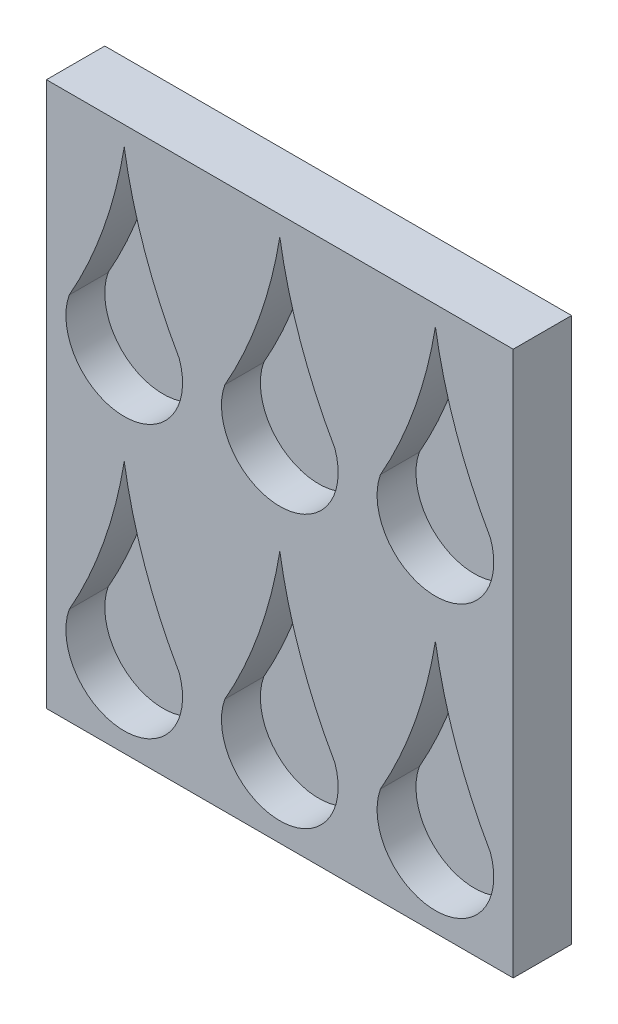
ISO-10303-21;
HEADER;
FILE_DESCRIPTION(('STEP AP214'),'2;1');
FILE_NAME('part.step','',(''),(''),'','','');
FILE_SCHEMA(('AUTOMOTIVE_DESIGN { 1 0 10303 214 1 1 1 1 }'));
ENDSEC;
DATA;
#1=APPLICATION_CONTEXT('core data for automotive mechanical design processes');
#2=APPLICATION_PROTOCOL_DEFINITION('international standard','automotive_design',2000,#1);
#3=PRODUCT_CONTEXT('',#1,'mechanical');
#4=PRODUCT('Part','Part','',(#3));
#5=PRODUCT_RELATED_PRODUCT_CATEGORY('part','',(#4));
#6=PRODUCT_DEFINITION_FORMATION('','',#4);
#7=PRODUCT_DEFINITION_CONTEXT('part definition',#1,'design');
#8=PRODUCT_DEFINITION('design','',#6,#7);
#9=PRODUCT_DEFINITION_SHAPE('','',#8);
#10=(LENGTH_UNIT() NAMED_UNIT(*) SI_UNIT(.MILLI.,.METRE.));
#11=(NAMED_UNIT(*) PLANE_ANGLE_UNIT() SI_UNIT($,.RADIAN.));
#12=(NAMED_UNIT(*) SI_UNIT($,.STERADIAN.) SOLID_ANGLE_UNIT());
#13=UNCERTAINTY_MEASURE_WITH_UNIT(LENGTH_MEASURE(1.E-05),#10,'distance_accuracy_value','');
#14=(GEOMETRIC_REPRESENTATION_CONTEXT(3) GLOBAL_UNCERTAINTY_ASSIGNED_CONTEXT((#13)) GLOBAL_UNIT_ASSIGNED_CONTEXT((#10,
#11,#12)) REPRESENTATION_CONTEXT('',''));
#15=CARTESIAN_POINT('',(0.,0.,0.));
#16=DIRECTION('',(0.,0.,1.));
#17=DIRECTION('',(1.,0.,0.));
#18=AXIS2_PLACEMENT_3D('',#15,#16,#17);
#19=CARTESIAN_POINT('',(101.6,151.599949999975,6.35));
#20=DIRECTION('',(0.,0.,1.));
#21=DIRECTION('',(1.,0.,0.));
#22=AXIS2_PLACEMENT_3D('',#19,#20,#21);
#23=PLANE('',#22);
#24=CARTESIAN_POINT('',(-48.8014709369517,151.599949999975,6.35));
#25=DIRECTION('',(0.,0.,-1.));
#26=DIRECTION('',(1.,0.,0.));
#27=AXIS2_PLACEMENT_3D('',#24,#25,#26);
#28=CIRCLE('',#27,152.4);
#29=CARTESIAN_POINT('',(101.6,127.,6.35));
#30=VERTEX_POINT('',#29);
#31=CARTESIAN_POINT('',(83.6394877578617,76.2,6.35));
#32=VERTEX_POINT('',#31);
#33=EDGE_CURVE('E59',#30,#32,#28,.T.);
#34=ORIENTED_EDGE('',*,*,#33,.T.);
#35=CARTESIAN_POINT('',(101.6,69.85,6.35));
#36=DIRECTION('',(0.,0.,1.));
#37=DIRECTION('',(1.,0.,0.));
#38=AXIS2_PLACEMENT_3D('',#35,#36,#37);
#39=CIRCLE('',#38,19.05);
#40=CARTESIAN_POINT('',(119.560512242138,76.2,6.35));
#41=VERTEX_POINT('',#40);
#42=EDGE_CURVE('E11',#32,#41,#39,.T.);
#43=ORIENTED_EDGE('',*,*,#42,.T.);
#44=CARTESIAN_POINT('',(252.001470936952,151.599949999975,6.35));
#45=DIRECTION('',(0.,0.,-1.));
#46=DIRECTION('',(-1.,0.,0.));
#47=AXIS2_PLACEMENT_3D('',#44,#45,#46);
#48=CIRCLE('',#47,152.4);
#49=EDGE_CURVE('E51',#41,#30,#48,.T.);
#50=ORIENTED_EDGE('',*,*,#49,.T.);
#51=EDGE_LOOP('',(#34,#43,#50));
#52=FACE_BOUND('',#51,.T.);
#53=ADVANCED_FACE('F37',(#52),#23,.T.);
#54=CARTESIAN_POINT('',(101.6,69.85,6.35));
#55=DIRECTION('',(0.,0.,1.));
#56=DIRECTION('',(1.,0.,0.));
#57=AXIS2_PLACEMENT_3D('',#54,#55,#56);
#58=CYLINDRICAL_SURFACE('',#57,19.05);
#59=CARTESIAN_POINT('',(101.6,69.85,19.05));
#60=DIRECTION('',(0.,0.,1.));
#61=DIRECTION('',(1.,0.,0.));
#62=AXIS2_PLACEMENT_3D('',#59,#60,#61);
#63=CIRCLE('',#62,19.05);
#64=CARTESIAN_POINT('',(83.6394877578617,76.2,19.05));
#65=VERTEX_POINT('',#64);
#66=CARTESIAN_POINT('',(119.560512242138,76.2,19.05));
#67=VERTEX_POINT('',#66);
#68=EDGE_CURVE('E358',#65,#67,#63,.T.);
#69=ORIENTED_EDGE('',*,*,#68,.T.);
#70=DIRECTION('',(0.,0.,1.));
#71=VECTOR('',#70,1.);
#72=CARTESIAN_POINT('',(119.560512242138,76.2,6.35));
#73=LINE('',#72,#71);
#74=EDGE_CURVE('E44',#41,#67,#73,.T.);
#75=ORIENTED_EDGE('',*,*,#74,.F.);
#76=ORIENTED_EDGE('',*,*,#42,.F.);
#77=DIRECTION('',(0.,0.,1.));
#78=VECTOR('',#77,1.);
#79=CARTESIAN_POINT('',(83.6394877578617,76.2,6.35));
#80=LINE('',#79,#78);
#81=EDGE_CURVE('E361',#32,#65,#80,.T.);
#82=ORIENTED_EDGE('',*,*,#81,.T.);
#83=EDGE_LOOP('',(#69,#75,#76,#82));
#84=FACE_BOUND('',#83,.T.);
#85=ADVANCED_FACE('F370',(#84),#58,.F.);
#86=CARTESIAN_POINT('',(252.001470936952,151.599949999975,6.35));
#87=DIRECTION('',(0.,0.,1.));
#88=DIRECTION('',(1.,0.,0.));
#89=AXIS2_PLACEMENT_3D('',#86,#87,#88);
#90=CYLINDRICAL_SURFACE('',#89,152.4);
#91=CARTESIAN_POINT('',(252.001470936952,151.599949999975,19.05));
#92=DIRECTION('',(0.,0.,-1.));
#93=DIRECTION('',(-1.,0.,0.));
#94=AXIS2_PLACEMENT_3D('',#91,#92,#93);
#95=CIRCLE('',#94,152.4);
#96=CARTESIAN_POINT('',(101.6,127.,19.05));
#97=VERTEX_POINT('',#96);
#98=EDGE_CURVE('E355',#67,#97,#95,.T.);
#99=ORIENTED_EDGE('',*,*,#98,.T.);
#100=DIRECTION('',(0.,0.,1.));
#101=VECTOR('',#100,1.);
#102=CARTESIAN_POINT('',(101.6,127.,6.35));
#103=LINE('',#102,#101);
#104=EDGE_CURVE('E365',#30,#97,#103,.T.);
#105=ORIENTED_EDGE('',*,*,#104,.F.);
#106=ORIENTED_EDGE('',*,*,#49,.F.);
#107=ORIENTED_EDGE('',*,*,#74,.T.);
#108=EDGE_LOOP('',(#99,#105,#106,#107));
#109=FACE_BOUND('',#108,.T.);
#110=ADVANCED_FACE('F367',(#109),#90,.T.);
#111=CARTESIAN_POINT('',(-48.8014709369517,151.599949999975,6.35));
#112=DIRECTION('',(0.,0.,1.));
#113=DIRECTION('',(1.,0.,0.));
#114=AXIS2_PLACEMENT_3D('',#111,#112,#113);
#115=CYLINDRICAL_SURFACE('',#114,152.4);
#116=CARTESIAN_POINT('',(-48.8014709369517,151.599949999975,19.05));
#117=DIRECTION('',(0.,0.,-1.));
#118=DIRECTION('',(1.,0.,0.));
#119=AXIS2_PLACEMENT_3D('',#116,#117,#118);
#120=CIRCLE('',#119,152.4);
#121=EDGE_CURVE('E353',#97,#65,#120,.T.);
#122=ORIENTED_EDGE('',*,*,#121,.T.);
#123=ORIENTED_EDGE('',*,*,#81,.F.);
#124=ORIENTED_EDGE('',*,*,#33,.F.);
#125=ORIENTED_EDGE('',*,*,#104,.T.);
#126=EDGE_LOOP('',(#122,#123,#124,#125));
#127=FACE_BOUND('',#126,.T.);
#128=ADVANCED_FACE('F380',(#127),#115,.T.);
#129=CARTESIAN_POINT('',(50.8,151.599949999975,6.35));
#130=DIRECTION('',(0.,0.,1.));
#131=DIRECTION('',(1.,0.,0.));
#132=AXIS2_PLACEMENT_3D('',#129,#130,#131);
#133=PLANE('',#132);
#134=CARTESIAN_POINT('',(-99.6014709369517,151.599949999975,6.35));
#135=DIRECTION('',(0.,0.,-1.));
#136=DIRECTION('',(1.,0.,0.));
#137=AXIS2_PLACEMENT_3D('',#134,#135,#136);
#138=CIRCLE('',#137,152.4);
#139=CARTESIAN_POINT('',(50.8,127.,6.35));
#140=VERTEX_POINT('',#139);
#141=CARTESIAN_POINT('',(32.8394877578617,76.2,6.35));
#142=VERTEX_POINT('',#141);
#143=EDGE_CURVE('E338',#140,#142,#138,.T.);
#144=ORIENTED_EDGE('',*,*,#143,.T.);
#145=CARTESIAN_POINT('',(50.8,69.85,6.35));
#146=DIRECTION('',(0.,0.,1.));
#147=DIRECTION('',(1.,0.,0.));
#148=AXIS2_PLACEMENT_3D('',#145,#146,#147);
#149=CIRCLE('',#148,19.05);
#150=CARTESIAN_POINT('',(68.7605122421383,76.2,6.35));
#151=VERTEX_POINT('',#150);
#152=EDGE_CURVE('E350',#142,#151,#149,.T.);
#153=ORIENTED_EDGE('',*,*,#152,.T.);
#154=CARTESIAN_POINT('',(201.201470936952,151.599949999975,6.35));
#155=DIRECTION('',(0.,0.,-1.));
#156=DIRECTION('',(-1.,0.,0.));
#157=AXIS2_PLACEMENT_3D('',#154,#155,#156);
#158=CIRCLE('',#157,152.4);
#159=EDGE_CURVE('E344',#151,#140,#158,.T.);
#160=ORIENTED_EDGE('',*,*,#159,.T.);
#161=EDGE_LOOP('',(#144,#153,#160));
#162=FACE_BOUND('',#161,.T.);
#163=ADVANCED_FACE('F385',(#162),#133,.T.);
#164=CARTESIAN_POINT('',(50.8,69.85,6.35));
#165=DIRECTION('',(0.,0.,1.));
#166=DIRECTION('',(1.,0.,0.));
#167=AXIS2_PLACEMENT_3D('',#164,#165,#166);
#168=CYLINDRICAL_SURFACE('',#167,19.05);
#169=CARTESIAN_POINT('',(50.8,69.85,19.05));
#170=DIRECTION('',(0.,0.,1.));
#171=DIRECTION('',(1.,0.,0.));
#172=AXIS2_PLACEMENT_3D('',#169,#170,#171);
#173=CIRCLE('',#172,19.05);
#174=CARTESIAN_POINT('',(32.8394877578617,76.2,19.05));
#175=VERTEX_POINT('',#174);
#176=CARTESIAN_POINT('',(68.7605122421383,76.2,19.05));
#177=VERTEX_POINT('',#176);
#178=EDGE_CURVE('E332',#175,#177,#173,.T.);
#179=ORIENTED_EDGE('',*,*,#178,.T.);
#180=DIRECTION('',(0.,0.,1.));
#181=VECTOR('',#180,1.);
#182=CARTESIAN_POINT('',(68.7605122421383,76.2,6.35));
#183=LINE('',#182,#181);
#184=EDGE_CURVE('E347',#151,#177,#183,.T.);
#185=ORIENTED_EDGE('',*,*,#184,.F.);
#186=ORIENTED_EDGE('',*,*,#152,.F.);
#187=DIRECTION('',(0.,0.,1.));
#188=VECTOR('',#187,1.);
#189=CARTESIAN_POINT('',(32.8394877578617,76.2,6.35));
#190=LINE('',#189,#188);
#191=EDGE_CURVE('E335',#142,#175,#190,.T.);
#192=ORIENTED_EDGE('',*,*,#191,.T.);
#193=EDGE_LOOP('',(#179,#185,#186,#192));
#194=FACE_BOUND('',#193,.T.);
#195=ADVANCED_FACE('F388',(#194),#168,.F.);
#196=CARTESIAN_POINT('',(201.201470936952,151.599949999975,6.35));
#197=DIRECTION('',(0.,0.,1.));
#198=DIRECTION('',(1.,0.,0.));
#199=AXIS2_PLACEMENT_3D('',#196,#197,#198);
#200=CYLINDRICAL_SURFACE('',#199,152.4);
#201=CARTESIAN_POINT('',(201.201470936952,151.599949999975,19.05));
#202=DIRECTION('',(0.,0.,-1.));
#203=DIRECTION('',(-1.,0.,0.));
#204=AXIS2_PLACEMENT_3D('',#201,#202,#203);
#205=CIRCLE('',#204,152.4);
#206=CARTESIAN_POINT('',(50.8,127.,19.05));
#207=VERTEX_POINT('',#206);
#208=EDGE_CURVE('E329',#177,#207,#205,.T.);
#209=ORIENTED_EDGE('',*,*,#208,.T.);
#210=DIRECTION('',(0.,0.,1.));
#211=VECTOR('',#210,1.);
#212=CARTESIAN_POINT('',(50.8,127.,6.35));
#213=LINE('',#212,#211);
#214=EDGE_CURVE('E341',#140,#207,#213,.T.);
#215=ORIENTED_EDGE('',*,*,#214,.F.);
#216=ORIENTED_EDGE('',*,*,#159,.F.);
#217=ORIENTED_EDGE('',*,*,#184,.T.);
#218=EDGE_LOOP('',(#209,#215,#216,#217));
#219=FACE_BOUND('',#218,.T.);
#220=ADVANCED_FACE('F392',(#219),#200,.T.);
#221=CARTESIAN_POINT('',(-99.6014709369517,151.599949999975,6.35));
#222=DIRECTION('',(0.,0.,1.));
#223=DIRECTION('',(1.,0.,0.));
#224=AXIS2_PLACEMENT_3D('',#221,#222,#223);
#225=CYLINDRICAL_SURFACE('',#224,152.4);
#226=CARTESIAN_POINT('',(-99.6014709369517,151.599949999975,19.05));
#227=DIRECTION('',(0.,0.,-1.));
#228=DIRECTION('',(1.,0.,0.));
#229=AXIS2_PLACEMENT_3D('',#226,#227,#228);
#230=CIRCLE('',#229,152.4);
#231=EDGE_CURVE('E327',#207,#175,#230,.T.);
#232=ORIENTED_EDGE('',*,*,#231,.T.);
#233=ORIENTED_EDGE('',*,*,#191,.F.);
#234=ORIENTED_EDGE('',*,*,#143,.F.);
#235=ORIENTED_EDGE('',*,*,#214,.T.);
#236=EDGE_LOOP('',(#232,#233,#234,#235));
#237=FACE_BOUND('',#236,.T.);
#238=ADVANCED_FACE('F396',(#237),#225,.T.);
#239=CARTESIAN_POINT('',(0.,151.599949999975,6.35));
#240=DIRECTION('',(0.,0.,1.));
#241=DIRECTION('',(1.,0.,0.));
#242=AXIS2_PLACEMENT_3D('',#239,#240,#241);
#243=PLANE('',#242);
#244=CARTESIAN_POINT('',(-150.401470936952,151.599949999975,6.35));
#245=DIRECTION('',(0.,0.,-1.));
#246=DIRECTION('',(1.,0.,0.));
#247=AXIS2_PLACEMENT_3D('',#244,#245,#246);
#248=CIRCLE('',#247,152.4);
#249=CARTESIAN_POINT('',(0.,127.,6.35));
#250=VERTEX_POINT('',#249);
#251=CARTESIAN_POINT('',(-17.9605122421383,76.2,6.35));
#252=VERTEX_POINT('',#251);
#253=EDGE_CURVE('E312',#250,#252,#248,.T.);
#254=ORIENTED_EDGE('',*,*,#253,.T.);
#255=CARTESIAN_POINT('',(0.,69.85,6.35));
#256=DIRECTION('',(0.,0.,1.));
#257=DIRECTION('',(1.,0.,0.));
#258=AXIS2_PLACEMENT_3D('',#255,#256,#257);
#259=CIRCLE('',#258,19.05);
#260=CARTESIAN_POINT('',(17.9605122421383,76.2,6.35));
#261=VERTEX_POINT('',#260);
#262=EDGE_CURVE('E324',#252,#261,#259,.T.);
#263=ORIENTED_EDGE('',*,*,#262,.T.);
#264=CARTESIAN_POINT('',(150.401470936952,151.599949999975,6.35));
#265=DIRECTION('',(0.,0.,-1.));
#266=DIRECTION('',(-1.,0.,0.));
#267=AXIS2_PLACEMENT_3D('',#264,#265,#266);
#268=CIRCLE('',#267,152.4);
#269=EDGE_CURVE('E318',#261,#250,#268,.T.);
#270=ORIENTED_EDGE('',*,*,#269,.T.);
#271=EDGE_LOOP('',(#254,#263,#270));
#272=FACE_BOUND('',#271,.T.);
#273=ADVANCED_FACE('F400',(#272),#243,.T.);
#274=CARTESIAN_POINT('',(0.,69.85,6.35));
#275=DIRECTION('',(0.,0.,1.));
#276=DIRECTION('',(1.,0.,0.));
#277=AXIS2_PLACEMENT_3D('',#274,#275,#276);
#278=CYLINDRICAL_SURFACE('',#277,19.05);
#279=CARTESIAN_POINT('',(0.,69.85,19.05));
#280=DIRECTION('',(0.,0.,1.));
#281=DIRECTION('',(1.,0.,0.));
#282=AXIS2_PLACEMENT_3D('',#279,#280,#281);
#283=CIRCLE('',#282,19.05);
#284=CARTESIAN_POINT('',(-17.9605122421383,76.2,19.05));
#285=VERTEX_POINT('',#284);
#286=CARTESIAN_POINT('',(17.9605122421383,76.2,19.05));
#287=VERTEX_POINT('',#286);
#288=EDGE_CURVE('E306',#285,#287,#283,.T.);
#289=ORIENTED_EDGE('',*,*,#288,.T.);
#290=DIRECTION('',(0.,0.,1.));
#291=VECTOR('',#290,1.);
#292=CARTESIAN_POINT('',(17.9605122421383,76.2,6.35));
#293=LINE('',#292,#291);
#294=EDGE_CURVE('E321',#261,#287,#293,.T.);
#295=ORIENTED_EDGE('',*,*,#294,.F.);
#296=ORIENTED_EDGE('',*,*,#262,.F.);
#297=DIRECTION('',(0.,0.,1.));
#298=VECTOR('',#297,1.);
#299=CARTESIAN_POINT('',(-17.9605122421383,76.2,6.35));
#300=LINE('',#299,#298);
#301=EDGE_CURVE('E309',#252,#285,#300,.T.);
#302=ORIENTED_EDGE('',*,*,#301,.T.);
#303=EDGE_LOOP('',(#289,#295,#296,#302));
#304=FACE_BOUND('',#303,.T.);
#305=ADVANCED_FACE('F404',(#304),#278,.F.);
#306=CARTESIAN_POINT('',(150.401470936952,151.599949999975,6.35));
#307=DIRECTION('',(0.,0.,1.));
#308=DIRECTION('',(1.,0.,0.));
#309=AXIS2_PLACEMENT_3D('',#306,#307,#308);
#310=CYLINDRICAL_SURFACE('',#309,152.4);
#311=CARTESIAN_POINT('',(150.401470936952,151.599949999975,19.05));
#312=DIRECTION('',(0.,0.,-1.));
#313=DIRECTION('',(-1.,0.,0.));
#314=AXIS2_PLACEMENT_3D('',#311,#312,#313);
#315=CIRCLE('',#314,152.4);
#316=CARTESIAN_POINT('',(0.,127.,19.05));
#317=VERTEX_POINT('',#316);
#318=EDGE_CURVE('E303',#287,#317,#315,.T.);
#319=ORIENTED_EDGE('',*,*,#318,.T.);
#320=DIRECTION('',(0.,0.,1.));
#321=VECTOR('',#320,1.);
#322=CARTESIAN_POINT('',(0.,127.,6.35));
#323=LINE('',#322,#321);
#324=EDGE_CURVE('E315',#250,#317,#323,.T.);
#325=ORIENTED_EDGE('',*,*,#324,.F.);
#326=ORIENTED_EDGE('',*,*,#269,.F.);
#327=ORIENTED_EDGE('',*,*,#294,.T.);
#328=EDGE_LOOP('',(#319,#325,#326,#327));
#329=FACE_BOUND('',#328,.T.);
#330=ADVANCED_FACE('F408',(#329),#310,.T.);
#331=CARTESIAN_POINT('',(-150.401470936952,151.599949999975,6.35));
#332=DIRECTION('',(0.,0.,1.));
#333=DIRECTION('',(1.,0.,0.));
#334=AXIS2_PLACEMENT_3D('',#331,#332,#333);
#335=CYLINDRICAL_SURFACE('',#334,152.4);
#336=CARTESIAN_POINT('',(-150.401470936952,151.599949999975,19.05));
#337=DIRECTION('',(0.,0.,-1.));
#338=DIRECTION('',(1.,0.,0.));
#339=AXIS2_PLACEMENT_3D('',#336,#337,#338);
#340=CIRCLE('',#339,152.4);
#341=EDGE_CURVE('E301',#317,#285,#340,.T.);
#342=ORIENTED_EDGE('',*,*,#341,.T.);
#343=ORIENTED_EDGE('',*,*,#301,.F.);
#344=ORIENTED_EDGE('',*,*,#253,.F.);
#345=ORIENTED_EDGE('',*,*,#324,.T.);
#346=EDGE_LOOP('',(#342,#343,#344,#345));
#347=FACE_BOUND('',#346,.T.);
#348=ADVANCED_FACE('F412',(#347),#335,.T.);
#349=CARTESIAN_POINT('',(101.6,62.699949999975,6.35));
#350=DIRECTION('',(0.,0.,1.));
#351=DIRECTION('',(1.,0.,0.));
#352=AXIS2_PLACEMENT_3D('',#349,#350,#351);
#353=PLANE('',#352);
#354=CARTESIAN_POINT('',(-48.8014709369517,62.699949999975,6.35));
#355=DIRECTION('',(0.,0.,-1.));
#356=DIRECTION('',(1.,0.,0.));
#357=AXIS2_PLACEMENT_3D('',#354,#355,#356);
#358=CIRCLE('',#357,152.4);
#359=CARTESIAN_POINT('',(101.6,38.1,6.35));
#360=VERTEX_POINT('',#359);
#361=CARTESIAN_POINT('',(83.6394877578617,-12.7,6.35));
#362=VERTEX_POINT('',#361);
#363=EDGE_CURVE('E286',#360,#362,#358,.T.);
#364=ORIENTED_EDGE('',*,*,#363,.T.);
#365=CARTESIAN_POINT('',(101.6,-19.05,6.35));
#366=DIRECTION('',(0.,0.,1.));
#367=DIRECTION('',(1.,0.,0.));
#368=AXIS2_PLACEMENT_3D('',#365,#366,#367);
#369=CIRCLE('',#368,19.05);
#370=CARTESIAN_POINT('',(119.560512242138,-12.7,6.35));
#371=VERTEX_POINT('',#370);
#372=EDGE_CURVE('E298',#362,#371,#369,.T.);
#373=ORIENTED_EDGE('',*,*,#372,.T.);
#374=CARTESIAN_POINT('',(252.001470936952,62.699949999975,6.35));
#375=DIRECTION('',(0.,0.,-1.));
#376=DIRECTION('',(-1.,0.,0.));
#377=AXIS2_PLACEMENT_3D('',#374,#375,#376);
#378=CIRCLE('',#377,152.4);
#379=EDGE_CURVE('E292',#371,#360,#378,.T.);
#380=ORIENTED_EDGE('',*,*,#379,.T.);
#381=EDGE_LOOP('',(#364,#373,#380));
#382=FACE_BOUND('',#381,.T.);
#383=ADVANCED_FACE('F416',(#382),#353,.T.);
#384=CARTESIAN_POINT('',(101.6,-19.05,6.35));
#385=DIRECTION('',(0.,0.,1.));
#386=DIRECTION('',(1.,0.,0.));
#387=AXIS2_PLACEMENT_3D('',#384,#385,#386);
#388=CYLINDRICAL_SURFACE('',#387,19.05);
#389=CARTESIAN_POINT('',(101.6,-19.05,19.05));
#390=DIRECTION('',(0.,0.,1.));
#391=DIRECTION('',(1.,0.,0.));
#392=AXIS2_PLACEMENT_3D('',#389,#390,#391);
#393=CIRCLE('',#392,19.05);
#394=CARTESIAN_POINT('',(83.6394877578617,-12.7,19.05));
#395=VERTEX_POINT('',#394);
#396=CARTESIAN_POINT('',(119.560512242138,-12.7,19.05));
#397=VERTEX_POINT('',#396);
#398=EDGE_CURVE('E280',#395,#397,#393,.T.);
#399=ORIENTED_EDGE('',*,*,#398,.T.);
#400=DIRECTION('',(0.,0.,1.));
#401=VECTOR('',#400,1.);
#402=CARTESIAN_POINT('',(119.560512242138,-12.7,6.35));
#403=LINE('',#402,#401);
#404=EDGE_CURVE('E295',#371,#397,#403,.T.);
#405=ORIENTED_EDGE('',*,*,#404,.F.);
#406=ORIENTED_EDGE('',*,*,#372,.F.);
#407=DIRECTION('',(0.,0.,1.));
#408=VECTOR('',#407,1.);
#409=CARTESIAN_POINT('',(83.6394877578617,-12.7,6.35));
#410=LINE('',#409,#408);
#411=EDGE_CURVE('E283',#362,#395,#410,.T.);
#412=ORIENTED_EDGE('',*,*,#411,.T.);
#413=EDGE_LOOP('',(#399,#405,#406,#412));
#414=FACE_BOUND('',#413,.T.);
#415=ADVANCED_FACE('F420',(#414),#388,.F.);
#416=CARTESIAN_POINT('',(252.001470936952,62.699949999975,6.35));
#417=DIRECTION('',(0.,0.,1.));
#418=DIRECTION('',(1.,0.,0.));
#419=AXIS2_PLACEMENT_3D('',#416,#417,#418);
#420=CYLINDRICAL_SURFACE('',#419,152.4);
#421=CARTESIAN_POINT('',(252.001470936952,62.699949999975,19.05));
#422=DIRECTION('',(0.,0.,-1.));
#423=DIRECTION('',(-1.,0.,0.));
#424=AXIS2_PLACEMENT_3D('',#421,#422,#423);
#425=CIRCLE('',#424,152.4);
#426=CARTESIAN_POINT('',(101.6,38.1,19.05));
#427=VERTEX_POINT('',#426);
#428=EDGE_CURVE('E277',#397,#427,#425,.T.);
#429=ORIENTED_EDGE('',*,*,#428,.T.);
#430=DIRECTION('',(0.,0.,1.));
#431=VECTOR('',#430,1.);
#432=CARTESIAN_POINT('',(101.6,38.1,6.35));
#433=LINE('',#432,#431);
#434=EDGE_CURVE('E289',#360,#427,#433,.T.);
#435=ORIENTED_EDGE('',*,*,#434,.F.);
#436=ORIENTED_EDGE('',*,*,#379,.F.);
#437=ORIENTED_EDGE('',*,*,#404,.T.);
#438=EDGE_LOOP('',(#429,#435,#436,#437));
#439=FACE_BOUND('',#438,.T.);
#440=ADVANCED_FACE('F424',(#439),#420,.T.);
#441=CARTESIAN_POINT('',(-48.8014709369517,62.699949999975,6.35));
#442=DIRECTION('',(0.,0.,1.));
#443=DIRECTION('',(1.,0.,0.));
#444=AXIS2_PLACEMENT_3D('',#441,#442,#443);
#445=CYLINDRICAL_SURFACE('',#444,152.4);
#446=CARTESIAN_POINT('',(-48.8014709369517,62.699949999975,19.05));
#447=DIRECTION('',(0.,0.,-1.));
#448=DIRECTION('',(1.,0.,0.));
#449=AXIS2_PLACEMENT_3D('',#446,#447,#448);
#450=CIRCLE('',#449,152.4);
#451=EDGE_CURVE('E275',#427,#395,#450,.T.);
#452=ORIENTED_EDGE('',*,*,#451,.T.);
#453=ORIENTED_EDGE('',*,*,#411,.F.);
#454=ORIENTED_EDGE('',*,*,#363,.F.);
#455=ORIENTED_EDGE('',*,*,#434,.T.);
#456=EDGE_LOOP('',(#452,#453,#454,#455));
#457=FACE_BOUND('',#456,.T.);
#458=ADVANCED_FACE('F428',(#457),#445,.T.);
#459=CARTESIAN_POINT('',(-25.4,-44.45,19.05));
#460=DIRECTION('',(1.,0.,0.));
#461=DIRECTION('',(0.,0.,-1.));
#462=AXIS2_PLACEMENT_3D('',#459,#460,#461);
#463=PLANE('',#462);
#464=DIRECTION('',(0.,-1.,0.));
#465=VECTOR('',#464,1.);
#466=CARTESIAN_POINT('',(-25.4,-44.45,0.));
#467=LINE('',#466,#465);
#468=CARTESIAN_POINT('',(-25.4,133.35,0.));
#469=VERTEX_POINT('',#468);
#470=CARTESIAN_POINT('',(-25.4,-44.45,0.));
#471=VERTEX_POINT('',#470);
#472=EDGE_CURVE('E260',#469,#471,#467,.T.);
#473=ORIENTED_EDGE('',*,*,#472,.T.);
#474=DIRECTION('',(0.,0.,-1.));
#475=VECTOR('',#474,1.);
#476=CARTESIAN_POINT('',(-25.4,-44.45,19.05));
#477=LINE('',#476,#475);
#478=CARTESIAN_POINT('',(-25.4,-44.45,19.05));
#479=VERTEX_POINT('',#478);
#480=EDGE_CURVE('E270',#479,#471,#477,.T.);
#481=ORIENTED_EDGE('',*,*,#480,.F.);
#482=DIRECTION('',(0.,-1.,0.));
#483=VECTOR('',#482,1.);
#484=CARTESIAN_POINT('',(-25.4,-44.45,19.05));
#485=LINE('',#484,#483);
#486=CARTESIAN_POINT('',(-25.4,133.35,19.05));
#487=VERTEX_POINT('',#486);
#488=EDGE_CURVE('E265',#487,#479,#485,.T.);
#489=ORIENTED_EDGE('',*,*,#488,.F.);
#490=DIRECTION('',(0.,0.,-1.));
#491=VECTOR('',#490,1.);
#492=CARTESIAN_POINT('',(-25.4,133.35,19.05));
#493=LINE('',#492,#491);
#494=EDGE_CURVE('E235',#487,#469,#493,.T.);
#495=ORIENTED_EDGE('',*,*,#494,.T.);
#496=EDGE_LOOP('',(#473,#481,#489,#495));
#497=FACE_BOUND('',#496,.T.);
#498=ADVANCED_FACE('F432',(#497),#463,.F.);
#499=CARTESIAN_POINT('',(-25.4,-44.45,19.05));
#500=DIRECTION('',(0.,1.,0.));
#501=DIRECTION('',(0.,0.,1.));
#502=AXIS2_PLACEMENT_3D('',#499,#500,#501);
#503=PLANE('',#502);
#504=DIRECTION('',(1.,0.,0.));
#505=VECTOR('',#504,1.);
#506=CARTESIAN_POINT('',(-25.4,-44.45,0.));
#507=LINE('',#506,#505);
#508=CARTESIAN_POINT('',(127.,-44.45,0.));
#509=VERTEX_POINT('',#508);
#510=EDGE_CURVE('E268',#471,#509,#507,.T.);
#511=ORIENTED_EDGE('',*,*,#510,.T.);
#512=DIRECTION('',(0.,0.,-1.));
#513=VECTOR('',#512,1.);
#514=CARTESIAN_POINT('',(127.,-44.45,19.05));
#515=LINE('',#514,#513);
#516=CARTESIAN_POINT('',(127.,-44.45,19.05));
#517=VERTEX_POINT('',#516);
#518=EDGE_CURVE('E226',#517,#509,#515,.T.);
#519=ORIENTED_EDGE('',*,*,#518,.F.);
#520=DIRECTION('',(1.,0.,0.));
#521=VECTOR('',#520,1.);
#522=CARTESIAN_POINT('',(-25.4,-44.45,19.05));
#523=LINE('',#522,#521);
#524=EDGE_CURVE('E267',#479,#517,#523,.T.);
#525=ORIENTED_EDGE('',*,*,#524,.F.);
#526=ORIENTED_EDGE('',*,*,#480,.T.);
#527=EDGE_LOOP('',(#511,#519,#525,#526));
#528=FACE_BOUND('',#527,.T.);
#529=ADVANCED_FACE('F436',(#528),#503,.F.);
#530=CARTESIAN_POINT('',(0.,0.,19.05));
#531=DIRECTION('',(0.,0.,-1.));
#532=DIRECTION('',(-1.,0.,0.));
#533=AXIS2_PLACEMENT_3D('',#530,#531,#532);
#534=PLANE('',#533);
#535=CARTESIAN_POINT('',(50.8,-19.05,19.05));
#536=DIRECTION('',(0.,0.,1.));
#537=DIRECTION('',(1.,0.,0.));
#538=AXIS2_PLACEMENT_3D('',#535,#536,#537);
#539=CIRCLE('',#538,19.05);
#540=CARTESIAN_POINT('',(32.8394877578617,-12.7,19.05));
#541=VERTEX_POINT('',#540);
#542=CARTESIAN_POINT('',(68.7605122421383,-12.7,19.05));
#543=VERTEX_POINT('',#542);
#544=EDGE_CURVE('E196',#541,#543,#539,.T.);
#545=ORIENTED_EDGE('',*,*,#544,.F.);
#546=CARTESIAN_POINT('',(-99.6014709369517,62.699949999975,19.05));
#547=DIRECTION('',(0.,0.,-1.));
#548=DIRECTION('',(1.,0.,0.));
#549=AXIS2_PLACEMENT_3D('',#546,#547,#548);
#550=CIRCLE('',#549,152.4);
#551=CARTESIAN_POINT('',(50.8,38.1,19.05));
#552=VERTEX_POINT('',#551);
#553=EDGE_CURVE('E209',#552,#541,#550,.T.);
#554=ORIENTED_EDGE('',*,*,#553,.F.);
#555=CARTESIAN_POINT('',(201.201470936952,62.699949999975,19.05));
#556=DIRECTION('',(0.,0.,-1.));
#557=DIRECTION('',(-1.,0.,0.));
#558=AXIS2_PLACEMENT_3D('',#555,#556,#557);
#559=CIRCLE('',#558,152.4);
#560=EDGE_CURVE('E210',#543,#552,#559,.T.);
#561=ORIENTED_EDGE('',*,*,#560,.F.);
#562=EDGE_LOOP('',(#545,#554,#561));
#563=FACE_BOUND('',#562,.T.);
#564=DIRECTION('',(-1.,0.,0.));
#565=VECTOR('',#564,1.);
#566=CARTESIAN_POINT('',(-25.4,133.35,19.05));
#567=LINE('',#566,#565);
#568=CARTESIAN_POINT('',(127.,133.35,19.05));
#569=VERTEX_POINT('',#568);
#570=EDGE_CURVE('E232',#569,#487,#567,.T.);
#571=ORIENTED_EDGE('',*,*,#570,.T.);
#572=ORIENTED_EDGE('',*,*,#488,.T.);
#573=ORIENTED_EDGE('',*,*,#524,.T.);
#574=DIRECTION('',(0.,1.,0.));
#575=VECTOR('',#574,1.);
#576=CARTESIAN_POINT('',(127.,-44.45,19.05));
#577=LINE('',#576,#575);
#578=EDGE_CURVE('E223',#517,#569,#577,.T.);
#579=ORIENTED_EDGE('',*,*,#578,.T.);
#580=EDGE_LOOP('',(#571,#572,#573,#579));
#581=FACE_BOUND('',#580,.T.);
#582=CARTESIAN_POINT('',(0.,-19.05,19.05));
#583=DIRECTION('',(0.,0.,1.));
#584=DIRECTION('',(1.,0.,0.));
#585=AXIS2_PLACEMENT_3D('',#582,#583,#584);
#586=CIRCLE('',#585,19.05);
#587=CARTESIAN_POINT('',(-17.9605122421383,-12.7,19.05));
#588=VERTEX_POINT('',#587);
#589=CARTESIAN_POINT('',(17.9605122421383,-12.7,19.05));
#590=VERTEX_POINT('',#589);
#591=EDGE_CURVE('E253',#588,#590,#586,.T.);
#592=ORIENTED_EDGE('',*,*,#591,.F.);
#593=CARTESIAN_POINT('',(-150.401470936952,62.699949999975,19.05));
#594=DIRECTION('',(0.,0.,-1.));
#595=DIRECTION('',(1.,0.,0.));
#596=AXIS2_PLACEMENT_3D('',#593,#594,#595);
#597=CIRCLE('',#596,152.4);
#598=CARTESIAN_POINT('',(0.,38.1,19.05));
#599=VERTEX_POINT('',#598);
#600=EDGE_CURVE('E240',#599,#588,#597,.T.);
#601=ORIENTED_EDGE('',*,*,#600,.F.);
#602=CARTESIAN_POINT('',(150.401470936952,62.699949999975,19.05));
#603=DIRECTION('',(0.,0.,-1.));
#604=DIRECTION('',(-1.,0.,0.));
#605=AXIS2_PLACEMENT_3D('',#602,#603,#604);
#606=CIRCLE('',#605,152.4);
#607=EDGE_CURVE('E245',#590,#599,#606,.T.);
#608=ORIENTED_EDGE('',*,*,#607,.F.);
#609=EDGE_LOOP('',(#592,#601,#608));
#610=FACE_BOUND('',#609,.T.);
#611=ORIENTED_EDGE('',*,*,#451,.F.);
#612=ORIENTED_EDGE('',*,*,#428,.F.);
#613=ORIENTED_EDGE('',*,*,#398,.F.);
#614=EDGE_LOOP('',(#611,#612,#613));
#615=FACE_BOUND('',#614,.T.);
#616=ORIENTED_EDGE('',*,*,#341,.F.);
#617=ORIENTED_EDGE('',*,*,#318,.F.);
#618=ORIENTED_EDGE('',*,*,#288,.F.);
#619=EDGE_LOOP('',(#616,#617,#618));
#620=FACE_BOUND('',#619,.T.);
#621=ORIENTED_EDGE('',*,*,#231,.F.);
#622=ORIENTED_EDGE('',*,*,#208,.F.);
#623=ORIENTED_EDGE('',*,*,#178,.F.);
#624=EDGE_LOOP('',(#621,#622,#623));
#625=FACE_BOUND('',#624,.T.);
#626=ORIENTED_EDGE('',*,*,#121,.F.);
#627=ORIENTED_EDGE('',*,*,#98,.F.);
#628=ORIENTED_EDGE('',*,*,#68,.F.);
#629=EDGE_LOOP('',(#626,#627,#628));
#630=FACE_BOUND('',#629,.T.);
#631=ADVANCED_FACE('F440',(#563,#581,#610,#615,#620,#625,#630),#534,.F.);
#632=CARTESIAN_POINT('',(0.,0.,0.));
#633=DIRECTION('',(0.,0.,-1.));
#634=DIRECTION('',(-1.,0.,0.));
#635=AXIS2_PLACEMENT_3D('',#632,#633,#634);
#636=PLANE('',#635);
#637=ORIENTED_EDGE('',*,*,#472,.F.);
#638=DIRECTION('',(-1.,0.,0.));
#639=VECTOR('',#638,1.);
#640=CARTESIAN_POINT('',(-25.4,133.35,0.));
#641=LINE('',#640,#639);
#642=CARTESIAN_POINT('',(127.,133.35,0.));
#643=VERTEX_POINT('',#642);
#644=EDGE_CURVE('E231',#643,#469,#641,.T.);
#645=ORIENTED_EDGE('',*,*,#644,.F.);
#646=DIRECTION('',(0.,1.,0.));
#647=VECTOR('',#646,1.);
#648=CARTESIAN_POINT('',(127.,-44.45,0.));
#649=LINE('',#648,#647);
#650=EDGE_CURVE('E222',#509,#643,#649,.T.);
#651=ORIENTED_EDGE('',*,*,#650,.F.);
#652=ORIENTED_EDGE('',*,*,#510,.F.);
#653=EDGE_LOOP('',(#637,#645,#651,#652));
#654=FACE_BOUND('',#653,.T.);
#655=ADVANCED_FACE('F442',(#654),#636,.T.);
#656=CARTESIAN_POINT('',(-150.401470936952,62.699949999975,6.35));
#657=DIRECTION('',(0.,0.,1.));
#658=DIRECTION('',(1.,0.,0.));
#659=AXIS2_PLACEMENT_3D('',#656,#657,#658);
#660=CYLINDRICAL_SURFACE('',#659,152.4);
#661=ORIENTED_EDGE('',*,*,#600,.T.);
#662=DIRECTION('',(0.,0.,1.));
#663=VECTOR('',#662,1.);
#664=CARTESIAN_POINT('',(-17.9605122421383,-12.7,6.35));
#665=LINE('',#664,#663);
#666=CARTESIAN_POINT('',(-17.9605122421383,-12.7,6.35));
#667=VERTEX_POINT('',#666);
#668=EDGE_CURVE('E251',#667,#588,#665,.T.);
#669=ORIENTED_EDGE('',*,*,#668,.F.);
#670=CARTESIAN_POINT('',(-150.401470936952,62.699949999975,6.35));
#671=DIRECTION('',(0.,0.,-1.));
#672=DIRECTION('',(1.,0.,0.));
#673=AXIS2_PLACEMENT_3D('',#670,#671,#672);
#674=CIRCLE('',#673,152.4);
#675=CARTESIAN_POINT('',(0.,38.1,6.35));
#676=VERTEX_POINT('',#675);
#677=EDGE_CURVE('E241',#676,#667,#674,.T.);
#678=ORIENTED_EDGE('',*,*,#677,.F.);
#679=DIRECTION('',(0.,0.,1.));
#680=VECTOR('',#679,1.);
#681=CARTESIAN_POINT('',(0.,38.1,6.35));
#682=LINE('',#681,#680);
#683=EDGE_CURVE('E258',#676,#599,#682,.T.);
#684=ORIENTED_EDGE('',*,*,#683,.T.);
#685=EDGE_LOOP('',(#661,#669,#678,#684));
#686=FACE_BOUND('',#685,.T.);
#687=ADVANCED_FACE('F445',(#686),#660,.T.);
#688=CARTESIAN_POINT('',(150.401470936952,62.699949999975,6.35));
#689=DIRECTION('',(0.,0.,1.));
#690=DIRECTION('',(1.,0.,0.));
#691=AXIS2_PLACEMENT_3D('',#688,#689,#690);
#692=CYLINDRICAL_SURFACE('',#691,152.4);
#693=ORIENTED_EDGE('',*,*,#607,.T.);
#694=ORIENTED_EDGE('',*,*,#683,.F.);
#695=CARTESIAN_POINT('',(150.401470936952,62.699949999975,6.35));
#696=DIRECTION('',(0.,0.,-1.));
#697=DIRECTION('',(-1.,0.,0.));
#698=AXIS2_PLACEMENT_3D('',#695,#696,#697);
#699=CIRCLE('',#698,152.4);
#700=CARTESIAN_POINT('',(17.9605122421383,-12.7,6.35));
#701=VERTEX_POINT('',#700);
#702=EDGE_CURVE('E248',#701,#676,#699,.T.);
#703=ORIENTED_EDGE('',*,*,#702,.F.);
#704=DIRECTION('',(0.,0.,1.));
#705=VECTOR('',#704,1.);
#706=CARTESIAN_POINT('',(17.9605122421383,-12.7,6.35));
#707=LINE('',#706,#705);
#708=EDGE_CURVE('E261',#701,#590,#707,.T.);
#709=ORIENTED_EDGE('',*,*,#708,.T.);
#710=EDGE_LOOP('',(#693,#694,#703,#709));
#711=FACE_BOUND('',#710,.T.);
#712=ADVANCED_FACE('F452',(#711),#692,.T.);
#713=CARTESIAN_POINT('',(0.,-19.05,6.35));
#714=DIRECTION('',(0.,0.,1.));
#715=DIRECTION('',(1.,0.,0.));
#716=AXIS2_PLACEMENT_3D('',#713,#714,#715);
#717=CYLINDRICAL_SURFACE('',#716,19.05);
#718=ORIENTED_EDGE('',*,*,#591,.T.);
#719=ORIENTED_EDGE('',*,*,#708,.F.);
#720=CARTESIAN_POINT('',(0.,-19.05,6.35));
#721=DIRECTION('',(0.,0.,1.));
#722=DIRECTION('',(1.,0.,0.));
#723=AXIS2_PLACEMENT_3D('',#720,#721,#722);
#724=CIRCLE('',#723,19.05);
#725=EDGE_CURVE('E244',#667,#701,#724,.T.);
#726=ORIENTED_EDGE('',*,*,#725,.F.);
#727=ORIENTED_EDGE('',*,*,#668,.T.);
#728=EDGE_LOOP('',(#718,#719,#726,#727));
#729=FACE_BOUND('',#728,.T.);
#730=ADVANCED_FACE('F454',(#729),#717,.F.);
#731=CARTESIAN_POINT('',(0.,62.699949999975,6.35));
#732=DIRECTION('',(0.,0.,1.));
#733=DIRECTION('',(1.,0.,0.));
#734=AXIS2_PLACEMENT_3D('',#731,#732,#733);
#735=PLANE('',#734);
#736=ORIENTED_EDGE('',*,*,#677,.T.);
#737=ORIENTED_EDGE('',*,*,#725,.T.);
#738=ORIENTED_EDGE('',*,*,#702,.T.);
#739=EDGE_LOOP('',(#736,#737,#738));
#740=FACE_BOUND('',#739,.T.);
#741=ADVANCED_FACE('F457',(#740),#735,.T.);
#742=CARTESIAN_POINT('',(-25.4,133.35,19.05));
#743=DIRECTION('',(0.,-1.,0.));
#744=DIRECTION('',(0.,0.,-1.));
#745=AXIS2_PLACEMENT_3D('',#742,#743,#744);
#746=PLANE('',#745);
#747=ORIENTED_EDGE('',*,*,#644,.T.);
#748=ORIENTED_EDGE('',*,*,#494,.F.);
#749=ORIENTED_EDGE('',*,*,#570,.F.);
#750=DIRECTION('',(0.,0.,-1.));
#751=VECTOR('',#750,1.);
#752=CARTESIAN_POINT('',(127.,133.35,19.05));
#753=LINE('',#752,#751);
#754=EDGE_CURVE('E219',#569,#643,#753,.T.);
#755=ORIENTED_EDGE('',*,*,#754,.T.);
#756=EDGE_LOOP('',(#747,#748,#749,#755));
#757=FACE_BOUND('',#756,.T.);
#758=ADVANCED_FACE('F464',(#757),#746,.F.);
#759=CARTESIAN_POINT('',(127.,-44.45,19.05));
#760=DIRECTION('',(-1.,0.,0.));
#761=DIRECTION('',(0.,0.,1.));
#762=AXIS2_PLACEMENT_3D('',#759,#760,#761);
#763=PLANE('',#762);
#764=ORIENTED_EDGE('',*,*,#650,.T.);
#765=ORIENTED_EDGE('',*,*,#754,.F.);
#766=ORIENTED_EDGE('',*,*,#578,.F.);
#767=ORIENTED_EDGE('',*,*,#518,.T.);
#768=EDGE_LOOP('',(#764,#765,#766,#767));
#769=FACE_BOUND('',#768,.T.);
#770=ADVANCED_FACE('F468',(#769),#763,.F.);
#771=CARTESIAN_POINT('',(-99.6014709369517,62.699949999975,6.35));
#772=DIRECTION('',(0.,0.,1.));
#773=DIRECTION('',(1.,0.,0.));
#774=AXIS2_PLACEMENT_3D('',#771,#772,#773);
#775=CYLINDRICAL_SURFACE('',#774,152.4);
#776=ORIENTED_EDGE('',*,*,#553,.T.);
#777=DIRECTION('',(0.,0.,1.));
#778=VECTOR('',#777,1.);
#779=CARTESIAN_POINT('',(32.8394877578617,-12.7,6.35));
#780=LINE('',#779,#778);
#781=CARTESIAN_POINT('',(32.8394877578617,-12.7,6.35));
#782=VERTEX_POINT('',#781);
#783=EDGE_CURVE('E202',#782,#541,#780,.T.);
#784=ORIENTED_EDGE('',*,*,#783,.F.);
#785=CARTESIAN_POINT('',(-99.6014709369517,62.699949999975,6.35));
#786=DIRECTION('',(0.,0.,-1.));
#787=DIRECTION('',(1.,0.,0.));
#788=AXIS2_PLACEMENT_3D('',#785,#786,#787);
#789=CIRCLE('',#788,152.4);
#790=CARTESIAN_POINT('',(50.8,38.1,6.35));
#791=VERTEX_POINT('',#790);
#792=EDGE_CURVE('E186',#791,#782,#789,.T.);
#793=ORIENTED_EDGE('',*,*,#792,.F.);
#794=DIRECTION('',(0.,0.,1.));
#795=VECTOR('',#794,1.);
#796=CARTESIAN_POINT('',(50.8,38.1,6.35));
#797=LINE('',#796,#795);
#798=EDGE_CURVE('E212',#791,#552,#797,.T.);
#799=ORIENTED_EDGE('',*,*,#798,.T.);
#800=EDGE_LOOP('',(#776,#784,#793,#799));
#801=FACE_BOUND('',#800,.T.);
#802=ADVANCED_FACE('F207',(#801),#775,.T.);
#803=CARTESIAN_POINT('',(201.201470936952,62.699949999975,6.35));
#804=DIRECTION('',(0.,0.,1.));
#805=DIRECTION('',(1.,0.,0.));
#806=AXIS2_PLACEMENT_3D('',#803,#804,#805);
#807=CYLINDRICAL_SURFACE('',#806,152.4);
#808=ORIENTED_EDGE('',*,*,#560,.T.);
#809=ORIENTED_EDGE('',*,*,#798,.F.);
#810=CARTESIAN_POINT('',(201.201470936952,62.699949999975,6.35));
#811=DIRECTION('',(0.,0.,-1.));
#812=DIRECTION('',(-1.,0.,0.));
#813=AXIS2_PLACEMENT_3D('',#810,#811,#812);
#814=CIRCLE('',#813,152.4);
#815=CARTESIAN_POINT('',(68.7605122421383,-12.7,6.35));
#816=VERTEX_POINT('',#815);
#817=EDGE_CURVE('E191',#816,#791,#814,.T.);
#818=ORIENTED_EDGE('',*,*,#817,.F.);
#819=DIRECTION('',(0.,0.,1.));
#820=VECTOR('',#819,1.);
#821=CARTESIAN_POINT('',(68.7605122421383,-12.7,6.35));
#822=LINE('',#821,#820);
#823=EDGE_CURVE('E205',#816,#543,#822,.T.);
#824=ORIENTED_EDGE('',*,*,#823,.T.);
#825=EDGE_LOOP('',(#808,#809,#818,#824));
#826=FACE_BOUND('',#825,.T.);
#827=ADVANCED_FACE('F475',(#826),#807,.T.);
#828=CARTESIAN_POINT('',(50.8,-19.05,6.35));
#829=DIRECTION('',(0.,0.,1.));
#830=DIRECTION('',(1.,0.,0.));
#831=AXIS2_PLACEMENT_3D('',#828,#829,#830);
#832=CYLINDRICAL_SURFACE('',#831,19.05);
#833=ORIENTED_EDGE('',*,*,#544,.T.);
#834=ORIENTED_EDGE('',*,*,#823,.F.);
#835=CARTESIAN_POINT('',(50.8,-19.05,6.35));
#836=DIRECTION('',(0.,0.,1.));
#837=DIRECTION('',(1.,0.,0.));
#838=AXIS2_PLACEMENT_3D('',#835,#836,#837);
#839=CIRCLE('',#838,19.05);
#840=EDGE_CURVE('E189',#782,#816,#839,.T.);
#841=ORIENTED_EDGE('',*,*,#840,.F.);
#842=ORIENTED_EDGE('',*,*,#783,.T.);
#843=EDGE_LOOP('',(#833,#834,#841,#842));
#844=FACE_BOUND('',#843,.T.);
#845=ADVANCED_FACE('F201',(#844),#832,.F.);
#846=CARTESIAN_POINT('',(50.8,62.699949999975,6.35));
#847=DIRECTION('',(0.,0.,1.));
#848=DIRECTION('',(1.,0.,0.));
#849=AXIS2_PLACEMENT_3D('',#846,#847,#848);
#850=PLANE('',#849);
#851=ORIENTED_EDGE('',*,*,#792,.T.);
#852=ORIENTED_EDGE('',*,*,#840,.T.);
#853=ORIENTED_EDGE('',*,*,#817,.T.);
#854=EDGE_LOOP('',(#851,#852,#853));
#855=FACE_BOUND('',#854,.T.);
#856=ADVANCED_FACE('F188',(#855),#850,.T.);
#857=CLOSED_SHELL('',(#53,#85,#110,#128,#163,#195,#220,#238,#273,#305,#330,#348,#383,#415,#440,
#458,#498,#529,#631,#655,#687,#712,#730,#741,#758,#770,#802,#827,#845,#856));
#858=MANIFOLD_SOLID_BREP('B2',#857);
#859=ADVANCED_BREP_SHAPE_REPRESENTATION('',(#18,#858),#14);
#860=SHAPE_DEFINITION_REPRESENTATION(#9,#859);
ENDSEC;
END-ISO-10303-21;
